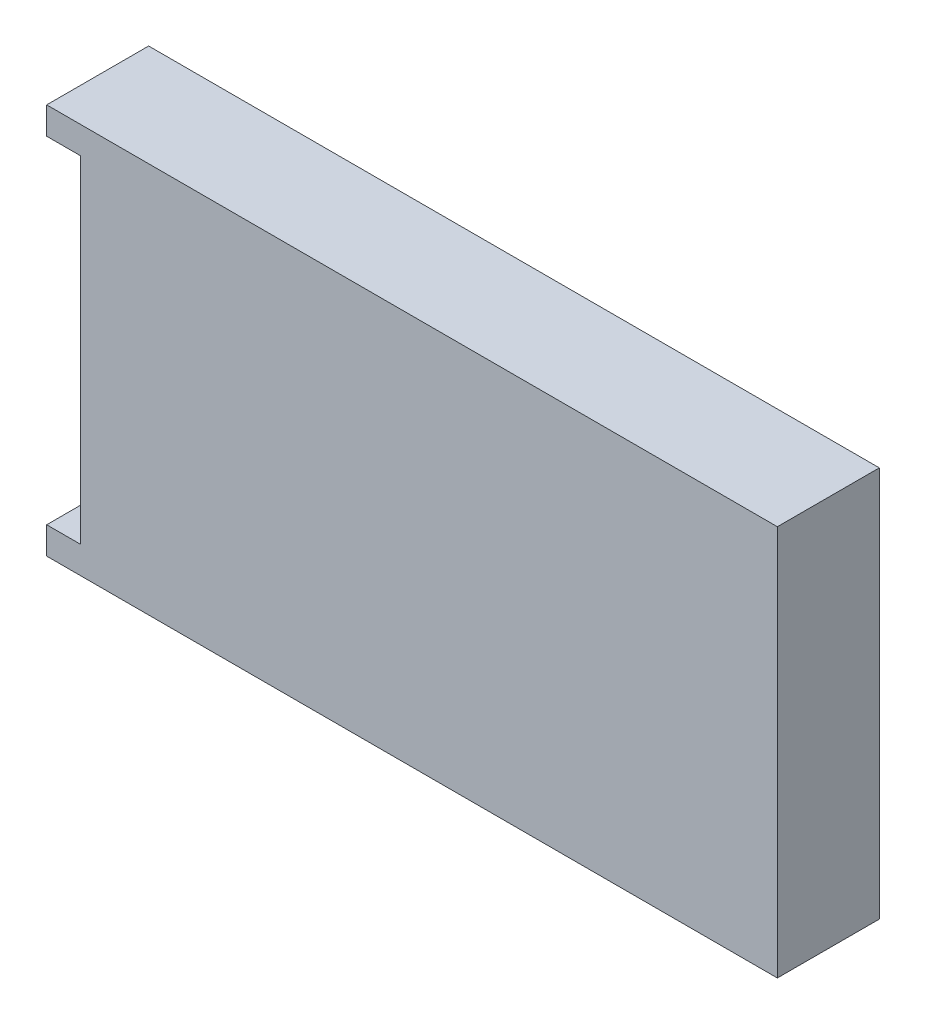
ISO-10303-21;
HEADER;
FILE_DESCRIPTION(('STEP AP214'),'2;1');
FILE_NAME('part.step','',(''),(''),'','','');
FILE_SCHEMA(('AUTOMOTIVE_DESIGN { 1 0 10303 214 1 1 1 1 }'));
ENDSEC;
DATA;
#1=APPLICATION_CONTEXT('core data for automotive mechanical design processes');
#2=APPLICATION_PROTOCOL_DEFINITION('international standard','automotive_design',2000,#1);
#3=PRODUCT_CONTEXT('',#1,'mechanical');
#4=PRODUCT('Part','Part','',(#3));
#5=PRODUCT_RELATED_PRODUCT_CATEGORY('part','',(#4));
#6=PRODUCT_DEFINITION_FORMATION('','',#4);
#7=PRODUCT_DEFINITION_CONTEXT('part definition',#1,'design');
#8=PRODUCT_DEFINITION('design','',#6,#7);
#9=PRODUCT_DEFINITION_SHAPE('','',#8);
#10=(LENGTH_UNIT() NAMED_UNIT(*) SI_UNIT(.MILLI.,.METRE.));
#11=(NAMED_UNIT(*) PLANE_ANGLE_UNIT() SI_UNIT($,.RADIAN.));
#12=(NAMED_UNIT(*) SI_UNIT($,.STERADIAN.) SOLID_ANGLE_UNIT());
#13=UNCERTAINTY_MEASURE_WITH_UNIT(LENGTH_MEASURE(1.E-05),#10,'distance_accuracy_value','');
#14=(GEOMETRIC_REPRESENTATION_CONTEXT(3) GLOBAL_UNCERTAINTY_ASSIGNED_CONTEXT((#13)) GLOBAL_UNIT_ASSIGNED_CONTEXT((#10,
#11,#12)) REPRESENTATION_CONTEXT('',''));
#15=CARTESIAN_POINT('',(0.,0.,0.));
#16=DIRECTION('',(0.,0.,1.));
#17=DIRECTION('',(1.,0.,0.));
#18=AXIS2_PLACEMENT_3D('',#15,#16,#17);
#19=CARTESIAN_POINT('',(-107.5,57.5,30.));
#20=DIRECTION('',(1.,0.,0.));
#21=DIRECTION('',(0.,1.,0.));
#22=AXIS2_PLACEMENT_3D('',#19,#20,#21);
#23=PLANE('',#22);
#24=DIRECTION('',(0.,-1.,0.));
#25=VECTOR('',#24,1.);
#26=CARTESIAN_POINT('',(-107.5,-49.5,15.));
#27=LINE('',#26,#25);
#28=CARTESIAN_POINT('',(-107.5,49.5,15.));
#29=VERTEX_POINT('',#28);
#30=CARTESIAN_POINT('',(-107.5,-49.5,15.));
#31=VERTEX_POINT('',#30);
#32=EDGE_CURVE('E112',#29,#31,#27,.T.);
#33=ORIENTED_EDGE('',*,*,#32,.F.);
#34=DIRECTION('',(0.,0.,1.));
#35=VECTOR('',#34,1.);
#36=CARTESIAN_POINT('',(-107.5,49.5,15.));
#37=LINE('',#36,#35);
#38=CARTESIAN_POINT('',(-107.5,49.5,30.));
#39=VERTEX_POINT('',#38);
#40=EDGE_CURVE('E142',#29,#39,#37,.T.);
#41=ORIENTED_EDGE('',*,*,#40,.T.);
#42=DIRECTION('',(0.,-1.,0.));
#43=VECTOR('',#42,1.);
#44=CARTESIAN_POINT('',(-107.5,57.5,30.));
#45=LINE('',#44,#43);
#46=CARTESIAN_POINT('',(-107.5,57.5,30.));
#47=VERTEX_POINT('',#46);
#48=EDGE_CURVE('E130',#47,#39,#45,.T.);
#49=ORIENTED_EDGE('',*,*,#48,.F.);
#50=DIRECTION('',(0.,0.,-1.));
#51=VECTOR('',#50,1.);
#52=CARTESIAN_POINT('',(-107.5,57.5,30.));
#53=LINE('',#52,#51);
#54=CARTESIAN_POINT('',(-107.5,57.5,0.));
#55=VERTEX_POINT('',#54);
#56=EDGE_CURVE('E137',#47,#55,#53,.T.);
#57=ORIENTED_EDGE('',*,*,#56,.T.);
#58=DIRECTION('',(0.,-1.,0.));
#59=VECTOR('',#58,1.);
#60=CARTESIAN_POINT('',(-107.5,57.5,0.));
#61=LINE('',#60,#59);
#62=CARTESIAN_POINT('',(-107.5,-57.5,0.));
#63=VERTEX_POINT('',#62);
#64=EDGE_CURVE('E138',#55,#63,#61,.T.);
#65=ORIENTED_EDGE('',*,*,#64,.T.);
#66=DIRECTION('',(0.,0.,-1.));
#67=VECTOR('',#66,1.);
#68=CARTESIAN_POINT('',(-107.5,-57.5,30.));
#69=LINE('',#68,#67);
#70=CARTESIAN_POINT('',(-107.5,-57.5,30.));
#71=VERTEX_POINT('',#70);
#72=EDGE_CURVE('E11',#71,#63,#69,.T.);
#73=ORIENTED_EDGE('',*,*,#72,.F.);
#74=CARTESIAN_POINT('',(-107.5,-49.5,30.));
#75=VERTEX_POINT('',#74);
#76=EDGE_CURVE('E82',#75,#71,#45,.T.);
#77=ORIENTED_EDGE('',*,*,#76,.F.);
#78=DIRECTION('',(0.,0.,1.));
#79=VECTOR('',#78,1.);
#80=CARTESIAN_POINT('',(-107.5,-49.5,15.));
#81=LINE('',#80,#79);
#82=EDGE_CURVE('E46',#31,#75,#81,.T.);
#83=ORIENTED_EDGE('',*,*,#82,.F.);
#84=EDGE_LOOP('',(#33,#41,#49,#57,#65,#73,#77,#83));
#85=FACE_BOUND('',#84,.T.);
#86=ADVANCED_FACE('F32',(#85),#23,.F.);
#87=CARTESIAN_POINT('',(-107.5,-57.5,30.));
#88=DIRECTION('',(0.,1.,0.));
#89=DIRECTION('',(0.,0.,1.));
#90=AXIS2_PLACEMENT_3D('',#87,#88,#89);
#91=PLANE('',#90);
#92=DIRECTION('',(1.,0.,0.));
#93=VECTOR('',#92,1.);
#94=CARTESIAN_POINT('',(-107.5,-57.5,0.));
#95=LINE('',#94,#93);
#96=CARTESIAN_POINT('',(107.5,-57.5,0.));
#97=VERTEX_POINT('',#96);
#98=EDGE_CURVE('E141',#63,#97,#95,.T.);
#99=ORIENTED_EDGE('',*,*,#98,.T.);
#100=DIRECTION('',(0.,0.,-1.));
#101=VECTOR('',#100,1.);
#102=CARTESIAN_POINT('',(107.5,-57.5,30.));
#103=LINE('',#102,#101);
#104=CARTESIAN_POINT('',(107.5,-57.5,30.));
#105=VERTEX_POINT('',#104);
#106=EDGE_CURVE('E39',#105,#97,#103,.T.);
#107=ORIENTED_EDGE('',*,*,#106,.F.);
#108=DIRECTION('',(1.,0.,0.));
#109=VECTOR('',#108,1.);
#110=CARTESIAN_POINT('',(-107.5,-57.5,30.));
#111=LINE('',#110,#109);
#112=EDGE_CURVE('E132',#71,#105,#111,.T.);
#113=ORIENTED_EDGE('',*,*,#112,.F.);
#114=ORIENTED_EDGE('',*,*,#72,.T.);
#115=EDGE_LOOP('',(#99,#107,#113,#114));
#116=FACE_BOUND('',#115,.T.);
#117=ADVANCED_FACE('F170',(#116),#91,.F.);
#118=CARTESIAN_POINT('',(107.5,57.5,30.));
#119=DIRECTION('',(-1.,0.,0.));
#120=DIRECTION('',(0.,-1.,0.));
#121=AXIS2_PLACEMENT_3D('',#118,#119,#120);
#122=PLANE('',#121);
#123=DIRECTION('',(0.,1.,0.));
#124=VECTOR('',#123,1.);
#125=CARTESIAN_POINT('',(107.5,57.5,0.));
#126=LINE('',#125,#124);
#127=CARTESIAN_POINT('',(107.5,57.5,0.));
#128=VERTEX_POINT('',#127);
#129=EDGE_CURVE('E144',#97,#128,#126,.T.);
#130=ORIENTED_EDGE('',*,*,#129,.T.);
#131=DIRECTION('',(0.,0.,-1.));
#132=VECTOR('',#131,1.);
#133=CARTESIAN_POINT('',(107.5,57.5,30.));
#134=LINE('',#133,#132);
#135=CARTESIAN_POINT('',(107.5,57.5,30.));
#136=VERTEX_POINT('',#135);
#137=EDGE_CURVE('E148',#136,#128,#134,.T.);
#138=ORIENTED_EDGE('',*,*,#137,.F.);
#139=DIRECTION('',(0.,1.,0.));
#140=VECTOR('',#139,1.);
#141=CARTESIAN_POINT('',(107.5,57.5,30.));
#142=LINE('',#141,#140);
#143=EDGE_CURVE('E134',#105,#136,#142,.T.);
#144=ORIENTED_EDGE('',*,*,#143,.F.);
#145=ORIENTED_EDGE('',*,*,#106,.T.);
#146=EDGE_LOOP('',(#130,#138,#144,#145));
#147=FACE_BOUND('',#146,.T.);
#148=ADVANCED_FACE('F154',(#147),#122,.F.);
#149=CARTESIAN_POINT('',(-107.5,57.5,30.));
#150=DIRECTION('',(0.,-1.,0.));
#151=DIRECTION('',(0.,0.,-1.));
#152=AXIS2_PLACEMENT_3D('',#149,#150,#151);
#153=PLANE('',#152);
#154=DIRECTION('',(-1.,0.,0.));
#155=VECTOR('',#154,1.);
#156=CARTESIAN_POINT('',(-107.5,57.5,0.));
#157=LINE('',#156,#155);
#158=EDGE_CURVE('E76',#128,#55,#157,.T.);
#159=ORIENTED_EDGE('',*,*,#158,.T.);
#160=ORIENTED_EDGE('',*,*,#56,.F.);
#161=DIRECTION('',(-1.,0.,0.));
#162=VECTOR('',#161,1.);
#163=CARTESIAN_POINT('',(-107.5,57.5,30.));
#164=LINE('',#163,#162);
#165=EDGE_CURVE('E55',#136,#47,#164,.T.);
#166=ORIENTED_EDGE('',*,*,#165,.F.);
#167=ORIENTED_EDGE('',*,*,#137,.T.);
#168=EDGE_LOOP('',(#159,#160,#166,#167));
#169=FACE_BOUND('',#168,.T.);
#170=ADVANCED_FACE('F161',(#169),#153,.F.);
#171=CARTESIAN_POINT('',(0.,0.,30.));
#172=DIRECTION('',(0.,0.,1.));
#173=DIRECTION('',(1.,0.,0.));
#174=AXIS2_PLACEMENT_3D('',#171,#172,#173);
#175=PLANE('',#174);
#176=DIRECTION('',(-1.,0.,0.));
#177=VECTOR('',#176,1.);
#178=CARTESIAN_POINT('',(-107.5,49.5,30.));
#179=LINE('',#178,#177);
#180=CARTESIAN_POINT('',(-97.5,49.5,30.));
#181=VERTEX_POINT('',#180);
#182=EDGE_CURVE('E121',#181,#39,#179,.T.);
#183=ORIENTED_EDGE('',*,*,#182,.F.);
#184=DIRECTION('',(0.,1.,0.));
#185=VECTOR('',#184,1.);
#186=CARTESIAN_POINT('',(-97.5,-49.5,30.));
#187=LINE('',#186,#185);
#188=CARTESIAN_POINT('',(-97.5,-49.5,30.));
#189=VERTEX_POINT('',#188);
#190=EDGE_CURVE('E182',#189,#181,#187,.T.);
#191=ORIENTED_EDGE('',*,*,#190,.F.);
#192=DIRECTION('',(1.,0.,0.));
#193=VECTOR('',#192,1.);
#194=CARTESIAN_POINT('',(-107.5,-49.5,30.));
#195=LINE('',#194,#193);
#196=EDGE_CURVE('E185',#75,#189,#195,.T.);
#197=ORIENTED_EDGE('',*,*,#196,.F.);
#198=ORIENTED_EDGE('',*,*,#76,.T.);
#199=ORIENTED_EDGE('',*,*,#112,.T.);
#200=ORIENTED_EDGE('',*,*,#143,.T.);
#201=ORIENTED_EDGE('',*,*,#165,.T.);
#202=ORIENTED_EDGE('',*,*,#48,.T.);
#203=EDGE_LOOP('',(#183,#191,#197,#198,#199,#200,#201,#202));
#204=FACE_BOUND('',#203,.T.);
#205=ADVANCED_FACE('F163',(#204),#175,.T.);
#206=CARTESIAN_POINT('',(0.,0.,0.));
#207=DIRECTION('',(0.,0.,1.));
#208=DIRECTION('',(1.,0.,0.));
#209=AXIS2_PLACEMENT_3D('',#206,#207,#208);
#210=PLANE('',#209);
#211=ORIENTED_EDGE('',*,*,#64,.F.);
#212=ORIENTED_EDGE('',*,*,#158,.F.);
#213=ORIENTED_EDGE('',*,*,#129,.F.);
#214=ORIENTED_EDGE('',*,*,#98,.F.);
#215=EDGE_LOOP('',(#211,#212,#213,#214));
#216=FACE_BOUND('',#215,.T.);
#217=ADVANCED_FACE('F159',(#216),#210,.F.);
#218=CARTESIAN_POINT('',(-107.5,49.5,15.));
#219=DIRECTION('',(0.,1.,0.));
#220=DIRECTION('',(-1.,0.,0.));
#221=AXIS2_PLACEMENT_3D('',#218,#219,#220);
#222=PLANE('',#221);
#223=ORIENTED_EDGE('',*,*,#182,.T.);
#224=ORIENTED_EDGE('',*,*,#40,.F.);
#225=DIRECTION('',(-1.,0.,0.));
#226=VECTOR('',#225,1.);
#227=CARTESIAN_POINT('',(-107.5,49.5,15.));
#228=LINE('',#227,#226);
#229=CARTESIAN_POINT('',(-97.5,49.5,15.));
#230=VERTEX_POINT('',#229);
#231=EDGE_CURVE('E118',#230,#29,#228,.T.);
#232=ORIENTED_EDGE('',*,*,#231,.F.);
#233=DIRECTION('',(0.,0.,1.));
#234=VECTOR('',#233,1.);
#235=CARTESIAN_POINT('',(-97.5,49.5,15.));
#236=LINE('',#235,#234);
#237=EDGE_CURVE('E125',#230,#181,#236,.T.);
#238=ORIENTED_EDGE('',*,*,#237,.T.);
#239=EDGE_LOOP('',(#223,#224,#232,#238));
#240=FACE_BOUND('',#239,.T.);
#241=ADVANCED_FACE('F189',(#240),#222,.F.);
#242=CARTESIAN_POINT('',(-97.5,-49.5,15.));
#243=DIRECTION('',(1.,0.,0.));
#244=DIRECTION('',(0.,0.,-1.));
#245=AXIS2_PLACEMENT_3D('',#242,#243,#244);
#246=PLANE('',#245);
#247=ORIENTED_EDGE('',*,*,#190,.T.);
#248=ORIENTED_EDGE('',*,*,#237,.F.);
#249=DIRECTION('',(0.,1.,0.));
#250=VECTOR('',#249,1.);
#251=CARTESIAN_POINT('',(-97.5,-49.5,15.));
#252=LINE('',#251,#250);
#253=CARTESIAN_POINT('',(-97.5,-49.5,15.));
#254=VERTEX_POINT('',#253);
#255=EDGE_CURVE('E111',#254,#230,#252,.T.);
#256=ORIENTED_EDGE('',*,*,#255,.F.);
#257=DIRECTION('',(0.,0.,1.));
#258=VECTOR('',#257,1.);
#259=CARTESIAN_POINT('',(-97.5,-49.5,15.));
#260=LINE('',#259,#258);
#261=EDGE_CURVE('E107',#254,#189,#260,.T.);
#262=ORIENTED_EDGE('',*,*,#261,.T.);
#263=EDGE_LOOP('',(#247,#248,#256,#262));
#264=FACE_BOUND('',#263,.T.);
#265=ADVANCED_FACE('F191',(#264),#246,.F.);
#266=CARTESIAN_POINT('',(-107.5,-49.5,15.));
#267=DIRECTION('',(0.,-1.,0.));
#268=DIRECTION('',(1.,0.,0.));
#269=AXIS2_PLACEMENT_3D('',#266,#267,#268);
#270=PLANE('',#269);
#271=ORIENTED_EDGE('',*,*,#196,.T.);
#272=ORIENTED_EDGE('',*,*,#261,.F.);
#273=DIRECTION('',(1.,0.,0.));
#274=VECTOR('',#273,1.);
#275=CARTESIAN_POINT('',(-107.5,-49.5,15.));
#276=LINE('',#275,#274);
#277=EDGE_CURVE('E104',#31,#254,#276,.T.);
#278=ORIENTED_EDGE('',*,*,#277,.F.);
#279=ORIENTED_EDGE('',*,*,#82,.T.);
#280=EDGE_LOOP('',(#271,#272,#278,#279));
#281=FACE_BOUND('',#280,.T.);
#282=ADVANCED_FACE('F106',(#281),#270,.F.);
#283=CARTESIAN_POINT('',(0.,0.,15.));
#284=DIRECTION('',(0.,0.,-1.));
#285=DIRECTION('',(-1.,0.,0.));
#286=AXIS2_PLACEMENT_3D('',#283,#284,#285);
#287=PLANE('',#286);
#288=ORIENTED_EDGE('',*,*,#32,.T.);
#289=ORIENTED_EDGE('',*,*,#277,.T.);
#290=ORIENTED_EDGE('',*,*,#255,.T.);
#291=ORIENTED_EDGE('',*,*,#231,.T.);
#292=EDGE_LOOP('',(#288,#289,#290,#291));
#293=FACE_BOUND('',#292,.T.);
#294=ADVANCED_FACE('F116',(#293),#287,.F.);
#295=CLOSED_SHELL('',(#86,#117,#148,#170,#205,#217,#241,#265,#282,#294));
#296=MANIFOLD_SOLID_BREP('B2',#295);
#297=ADVANCED_BREP_SHAPE_REPRESENTATION('',(#18,#296),#14);
#298=SHAPE_DEFINITION_REPRESENTATION(#9,#297);
ENDSEC;
END-ISO-10303-21;
